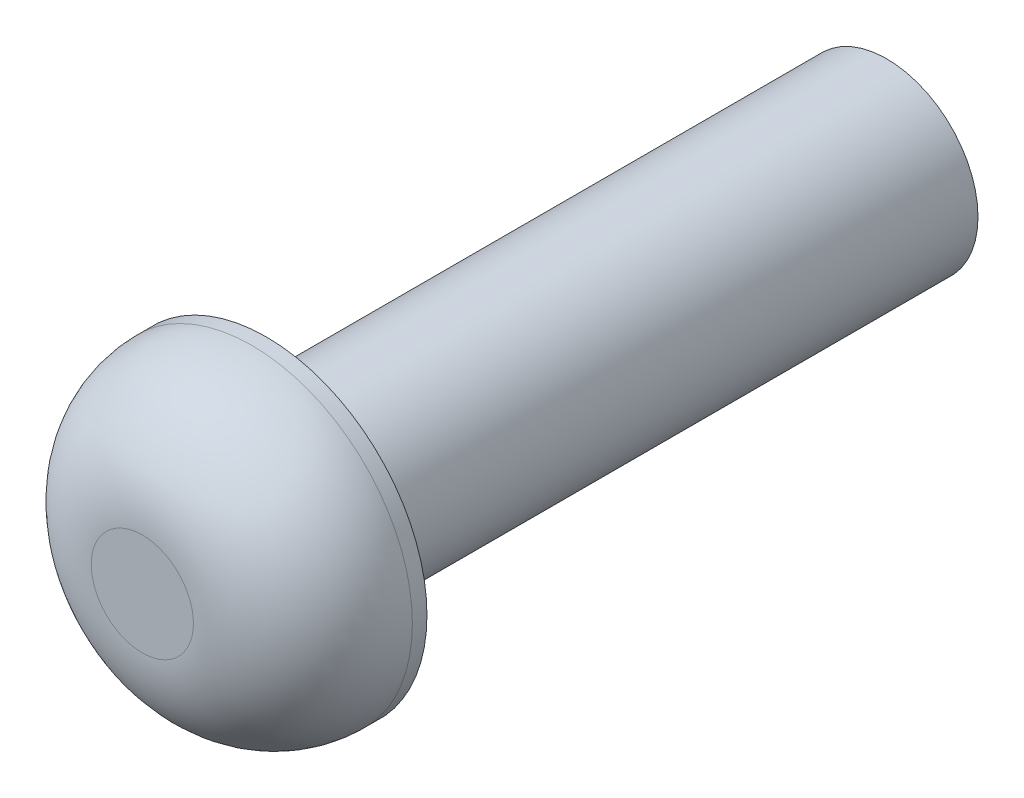
ISO-10303-21;
HEADER;
FILE_DESCRIPTION(('STEP AP214'),'2;1');
FILE_NAME('part.step','',(''),(''),'','','');
FILE_SCHEMA(('AUTOMOTIVE_DESIGN { 1 0 10303 214 1 1 1 1 }'));
ENDSEC;
DATA;
#1=APPLICATION_CONTEXT('core data for automotive mechanical design processes');
#2=APPLICATION_PROTOCOL_DEFINITION('international standard','automotive_design',2000,#1);
#3=PRODUCT_CONTEXT('',#1,'mechanical');
#4=PRODUCT('Part','Part','',(#3));
#5=PRODUCT_RELATED_PRODUCT_CATEGORY('part','',(#4));
#6=PRODUCT_DEFINITION_FORMATION('','',#4);
#7=PRODUCT_DEFINITION_CONTEXT('part definition',#1,'design');
#8=PRODUCT_DEFINITION('design','',#6,#7);
#9=PRODUCT_DEFINITION_SHAPE('','',#8);
#10=(LENGTH_UNIT() NAMED_UNIT(*) SI_UNIT(.MILLI.,.METRE.));
#11=(NAMED_UNIT(*) PLANE_ANGLE_UNIT() SI_UNIT($,.RADIAN.));
#12=(NAMED_UNIT(*) SI_UNIT($,.STERADIAN.) SOLID_ANGLE_UNIT());
#13=UNCERTAINTY_MEASURE_WITH_UNIT(LENGTH_MEASURE(1.E-05),#10,'distance_accuracy_value','');
#14=(GEOMETRIC_REPRESENTATION_CONTEXT(3) GLOBAL_UNCERTAINTY_ASSIGNED_CONTEXT((#13)) GLOBAL_UNIT_ASSIGNED_CONTEXT((#10,
#11,#12)) REPRESENTATION_CONTEXT('',''));
#15=CARTESIAN_POINT('',(0.,0.,0.));
#16=DIRECTION('',(0.,0.,1.));
#17=DIRECTION('',(1.,0.,0.));
#18=AXIS2_PLACEMENT_3D('',#15,#16,#17);
#19=CARTESIAN_POINT('',(0.,0.,17.));
#20=DIRECTION('',(0.,0.,-1.));
#21=DIRECTION('',(-1.,0.,0.));
#22=AXIS2_PLACEMENT_3D('',#19,#20,#21);
#23=CYLINDRICAL_SURFACE('',#22,2.5);
#24=CARTESIAN_POINT('',(0.,0.,17.));
#25=DIRECTION('',(0.,0.,1.));
#26=DIRECTION('',(1.,0.,0.));
#27=AXIS2_PLACEMENT_3D('',#24,#25,#26);
#28=CIRCLE('',#27,2.5);
#29=CARTESIAN_POINT('',(2.5,0.,17.));
#30=VERTEX_POINT('',#29);
#31=EDGE_CURVE('E50',#30,#30,#28,.T.);
#32=ORIENTED_EDGE('',*,*,#31,.F.);
#33=EDGE_LOOP('',(#32));
#34=FACE_BOUND('',#33,.T.);
#35=CARTESIAN_POINT('',(0.,0.,0.));
#36=DIRECTION('',(0.,0.,1.));
#37=DIRECTION('',(1.,0.,0.));
#38=AXIS2_PLACEMENT_3D('',#35,#36,#37);
#39=CIRCLE('',#38,2.5);
#40=CARTESIAN_POINT('',(2.5,0.,0.));
#41=VERTEX_POINT('',#40);
#42=EDGE_CURVE('E55',#41,#41,#39,.T.);
#43=ORIENTED_EDGE('',*,*,#42,.T.);
#44=EDGE_LOOP('',(#43));
#45=FACE_BOUND('',#44,.T.);
#46=ADVANCED_FACE('F37',(#34,#45),#23,.T.);
#47=CARTESIAN_POINT('',(0.,0.,0.));
#48=DIRECTION('',(0.,0.,1.));
#49=DIRECTION('',(1.,0.,0.));
#50=AXIS2_PLACEMENT_3D('',#47,#48,#49);
#51=PLANE('',#50);
#52=ORIENTED_EDGE('',*,*,#42,.F.);
#53=EDGE_LOOP('',(#52));
#54=FACE_BOUND('',#53,.T.);
#55=ADVANCED_FACE('F81',(#54),#51,.F.);
#56=CARTESIAN_POINT('',(0.,0.,20.4));
#57=DIRECTION('',(0.,0.,-1.));
#58=DIRECTION('',(-1.,0.,0.));
#59=AXIS2_PLACEMENT_3D('',#56,#57,#58);
#60=CYLINDRICAL_SURFACE('',#59,4.4);
#61=CARTESIAN_POINT('',(0.,0.,17.4));
#62=DIRECTION('',(0.,0.,1.));
#63=DIRECTION('',(1.,0.,0.));
#64=AXIS2_PLACEMENT_3D('',#61,#62,#63);
#65=CIRCLE('',#64,4.4);
#66=CARTESIAN_POINT('',(4.4,0.,17.4));
#67=VERTEX_POINT('',#66);
#68=EDGE_CURVE('E10',#67,#67,#65,.F.);
#69=ORIENTED_EDGE('',*,*,#68,.T.);
#70=EDGE_LOOP('',(#69));
#71=FACE_BOUND('',#70,.T.);
#72=CARTESIAN_POINT('',(0.,0.,17.));
#73=DIRECTION('',(0.,0.,1.));
#74=DIRECTION('',(1.,0.,0.));
#75=AXIS2_PLACEMENT_3D('',#72,#73,#74);
#76=CIRCLE('',#75,4.4);
#77=CARTESIAN_POINT('',(4.4,0.,17.));
#78=VERTEX_POINT('',#77);
#79=EDGE_CURVE('E60',#78,#78,#76,.T.);
#80=ORIENTED_EDGE('',*,*,#79,.T.);
#81=EDGE_LOOP('',(#80));
#82=FACE_BOUND('',#81,.T.);
#83=ADVANCED_FACE('F66',(#71,#82),#60,.T.);
#84=CARTESIAN_POINT('',(0.,0.,20.4));
#85=DIRECTION('',(0.,0.,1.));
#86=DIRECTION('',(1.,0.,0.));
#87=AXIS2_PLACEMENT_3D('',#84,#85,#86);
#88=PLANE('',#87);
#89=CARTESIAN_POINT('',(0.,0.,20.4));
#90=DIRECTION('',(0.,0.,1.));
#91=DIRECTION('',(1.,0.,0.));
#92=AXIS2_PLACEMENT_3D('',#89,#90,#91);
#93=CIRCLE('',#92,1.4);
#94=CARTESIAN_POINT('',(1.4,0.,20.4));
#95=VERTEX_POINT('',#94);
#96=EDGE_CURVE('E45',#95,#95,#93,.T.);
#97=ORIENTED_EDGE('',*,*,#96,.T.);
#98=EDGE_LOOP('',(#97));
#99=FACE_BOUND('',#98,.T.);
#100=ADVANCED_FACE('F70',(#99),#88,.T.);
#101=CARTESIAN_POINT('',(0.,0.,17.));
#102=DIRECTION('',(0.,0.,1.));
#103=DIRECTION('',(1.,0.,0.));
#104=AXIS2_PLACEMENT_3D('',#101,#102,#103);
#105=PLANE('',#104);
#106=ORIENTED_EDGE('',*,*,#31,.T.);
#107=EDGE_LOOP('',(#106));
#108=FACE_BOUND('',#107,.T.);
#109=ORIENTED_EDGE('',*,*,#79,.F.);
#110=EDGE_LOOP('',(#109));
#111=FACE_BOUND('',#110,.T.);
#112=ADVANCED_FACE('F68',(#108,#111),#105,.F.);
#113=CARTESIAN_POINT('',(0.,0.,17.4));
#114=DIRECTION('',(0.,0.,1.));
#115=DIRECTION('',(1.,0.,0.));
#116=AXIS2_PLACEMENT_3D('',#113,#114,#115);
#117=DEGENERATE_TOROIDAL_SURFACE('',#116,1.4,3.,.T.);
#118=ORIENTED_EDGE('',*,*,#68,.F.);
#119=EDGE_LOOP('',(#118));
#120=FACE_BOUND('',#119,.T.);
#121=ORIENTED_EDGE('',*,*,#96,.F.);
#122=EDGE_LOOP('',(#121));
#123=FACE_BOUND('',#122,.T.);
#124=ADVANCED_FACE('F39',(#120,#123),#117,.T.);
#125=CLOSED_SHELL('',(#46,#55,#83,#100,#112,#124));
#126=MANIFOLD_SOLID_BREP('B2',#125);
#127=ADVANCED_BREP_SHAPE_REPRESENTATION('',(#18,#126),#14);
#128=SHAPE_DEFINITION_REPRESENTATION(#9,#127);
ENDSEC;
END-ISO-10303-21;
